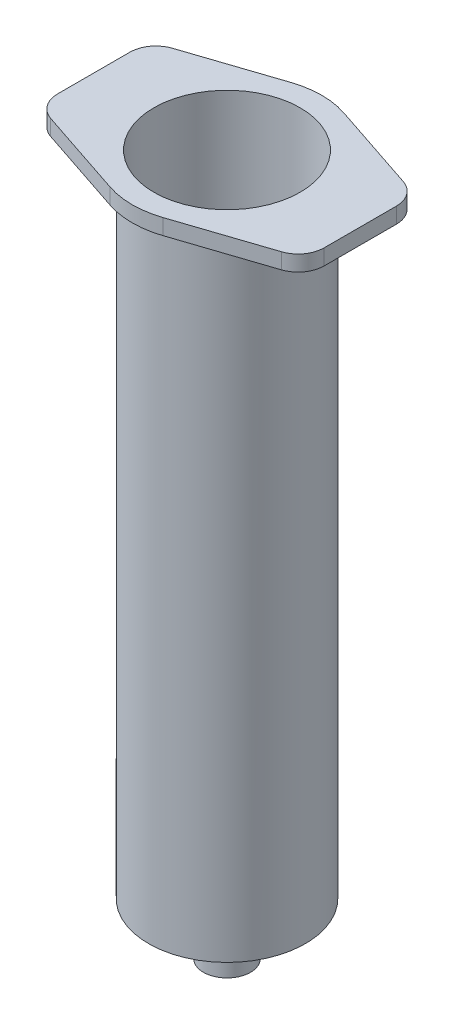
ISO-10303-21;
HEADER;
FILE_DESCRIPTION(('STEP AP214'),'2;1');
FILE_NAME('part.step','',(''),(''),'','','');
FILE_SCHEMA(('AUTOMOTIVE_DESIGN { 1 0 10303 214 1 1 1 1 }'));
ENDSEC;
DATA;
#1=APPLICATION_CONTEXT('core data for automotive mechanical design processes');
#2=APPLICATION_PROTOCOL_DEFINITION('international standard','automotive_design',2000,#1);
#3=PRODUCT_CONTEXT('',#1,'mechanical');
#4=PRODUCT('Part','Part','',(#3));
#5=PRODUCT_RELATED_PRODUCT_CATEGORY('part','',(#4));
#6=PRODUCT_DEFINITION_FORMATION('','',#4);
#7=PRODUCT_DEFINITION_CONTEXT('part definition',#1,'design');
#8=PRODUCT_DEFINITION('design','',#6,#7);
#9=PRODUCT_DEFINITION_SHAPE('','',#8);
#10=(LENGTH_UNIT() NAMED_UNIT(*) SI_UNIT(.MILLI.,.METRE.));
#11=(NAMED_UNIT(*) PLANE_ANGLE_UNIT() SI_UNIT($,.RADIAN.));
#12=(NAMED_UNIT(*) SI_UNIT($,.STERADIAN.) SOLID_ANGLE_UNIT());
#13=UNCERTAINTY_MEASURE_WITH_UNIT(LENGTH_MEASURE(1.E-05),#10,'distance_accuracy_value','');
#14=(GEOMETRIC_REPRESENTATION_CONTEXT(3) GLOBAL_UNCERTAINTY_ASSIGNED_CONTEXT((#13)) GLOBAL_UNIT_ASSIGNED_CONTEXT((#10,
#11,#12)) REPRESENTATION_CONTEXT('',''));
#15=CARTESIAN_POINT('',(0.,0.,0.));
#16=DIRECTION('',(0.,0.,1.));
#17=DIRECTION('',(1.,0.,0.));
#18=AXIS2_PLACEMENT_3D('',#15,#16,#17);
#19=CARTESIAN_POINT('',(0.,0.,0.));
#20=DIRECTION('',(0.,1.,0.));
#21=DIRECTION('',(-1.,0.,0.));
#22=AXIS2_PLACEMENT_3D('',#19,#20,#21);
#23=CYLINDRICAL_SURFACE('',#22,15.);
#24=CARTESIAN_POINT('',(0.,-124.,0.));
#25=DIRECTION('',(0.,1.,0.));
#26=DIRECTION('',(-1.,0.,0.));
#27=AXIS2_PLACEMENT_3D('',#24,#25,#26);
#28=CIRCLE('',#27,15.);
#29=CARTESIAN_POINT('',(-14.9999999999999,-124.,0.));
#30=VERTEX_POINT('',#29);
#31=EDGE_CURVE('E291',#30,#30,#28,.T.);
#32=ORIENTED_EDGE('',*,*,#31,.T.);
#33=EDGE_LOOP('',(#32));
#34=FACE_BOUND('',#33,.T.);
#35=CARTESIAN_POINT('',(0.,-3.,0.));
#36=DIRECTION('',(0.,1.,0.));
#37=DIRECTION('',(0.,0.,1.));
#38=AXIS2_PLACEMENT_3D('',#35,#36,#37);
#39=CIRCLE('',#38,15.);
#40=CARTESIAN_POINT('',(0.,-3.,15.));
#41=VERTEX_POINT('',#40);
#42=EDGE_CURVE('E167',#41,#41,#39,.T.);
#43=ORIENTED_EDGE('',*,*,#42,.F.);
#44=EDGE_LOOP('',(#43));
#45=FACE_BOUND('',#44,.T.);
#46=ADVANCED_FACE('F46',(#34,#45),#23,.T.);
#47=CARTESIAN_POINT('',(0.,-134.,0.));
#48=DIRECTION('',(0.,1.,0.));
#49=DIRECTION('',(-1.,0.,0.));
#50=AXIS2_PLACEMENT_3D('',#47,#48,#49);
#51=PLANE('',#50);
#52=CARTESIAN_POINT('',(0.,-134.,0.));
#53=DIRECTION('',(0.,1.,0.));
#54=DIRECTION('',(-1.,0.,0.));
#55=AXIS2_PLACEMENT_3D('',#52,#53,#54);
#56=CIRCLE('',#55,3.74999999999999);
#57=CARTESIAN_POINT('',(-3.74999999999999,-134.,0.));
#58=VERTEX_POINT('',#57);
#59=EDGE_CURVE('E282',#58,#58,#56,.T.);
#60=ORIENTED_EDGE('',*,*,#59,.T.);
#61=EDGE_LOOP('',(#60));
#62=FACE_BOUND('',#61,.T.);
#63=CARTESIAN_POINT('',(0.,-134.,0.));
#64=DIRECTION('',(0.,1.,0.));
#65=DIRECTION('',(-1.,0.,0.));
#66=AXIS2_PLACEMENT_3D('',#63,#64,#65);
#67=CIRCLE('',#66,4.49999999999999);
#68=CARTESIAN_POINT('',(-4.49999999999999,-134.,0.));
#69=VERTEX_POINT('',#68);
#70=EDGE_CURVE('E174',#69,#69,#67,.T.);
#71=ORIENTED_EDGE('',*,*,#70,.F.);
#72=EDGE_LOOP('',(#71));
#73=FACE_BOUND('',#72,.T.);
#74=ADVANCED_FACE('F309',(#62,#73),#51,.F.);
#75=CARTESIAN_POINT('',(0.,0.,0.));
#76=DIRECTION('',(0.,1.,0.));
#77=DIRECTION('',(-1.,0.,0.));
#78=AXIS2_PLACEMENT_3D('',#75,#76,#77);
#79=CYLINDRICAL_SURFACE('',#78,4.49999999999999);
#80=CARTESIAN_POINT('',(0.,-126.,0.));
#81=DIRECTION('',(0.,1.,0.));
#82=DIRECTION('',(-1.,0.,0.));
#83=AXIS2_PLACEMENT_3D('',#80,#81,#82);
#84=CIRCLE('',#83,4.49999999999999);
#85=CARTESIAN_POINT('',(-4.49999999999992,-126.,0.));
#86=VERTEX_POINT('',#85);
#87=EDGE_CURVE('E299',#86,#86,#84,.T.);
#88=ORIENTED_EDGE('',*,*,#87,.F.);
#89=EDGE_LOOP('',(#88));
#90=FACE_BOUND('',#89,.T.);
#91=ORIENTED_EDGE('',*,*,#70,.T.);
#92=EDGE_LOOP('',(#91));
#93=FACE_BOUND('',#92,.T.);
#94=ADVANCED_FACE('F307',(#90,#93),#79,.T.);
#95=CARTESIAN_POINT('',(0.,-126.,0.));
#96=DIRECTION('',(0.,1.,0.));
#97=DIRECTION('',(-1.,0.,0.));
#98=AXIS2_PLACEMENT_3D('',#95,#96,#97);
#99=CONICAL_SURFACE('',#98,4.49999999999999,1.38257482149013);
#100=CARTESIAN_POINT('',(-14.9999999999999,-124.,0.));
#101=CARTESIAN_POINT('',(-14.8906249999999,-124.020833333333,0.));
#102=CARTESIAN_POINT('',(-14.7812499999999,-124.041666666667,0.));
#103=CARTESIAN_POINT('',(-14.5624999999999,-124.083333333333,0.));
#104=CARTESIAN_POINT('',(-14.4531249999999,-124.104166666667,0.));
#105=CARTESIAN_POINT('',(-14.2343749999999,-124.145833333333,0.));
#106=CARTESIAN_POINT('',(-14.1249999999999,-124.166666666667,0.));
#107=CARTESIAN_POINT('',(-13.9062499999999,-124.208333333333,0.));
#108=CARTESIAN_POINT('',(-13.7968749999999,-124.229166666667,0.));
#109=CARTESIAN_POINT('',(-13.5781249999999,-124.270833333333,0.));
#110=CARTESIAN_POINT('',(-13.4687499999999,-124.291666666667,0.));
#111=CARTESIAN_POINT('',(-13.2499999999999,-124.333333333333,0.));
#112=CARTESIAN_POINT('',(-13.1406249999999,-124.354166666667,0.));
#113=CARTESIAN_POINT('',(-12.9218749999999,-124.395833333333,0.));
#114=CARTESIAN_POINT('',(-12.8124999999999,-124.416666666667,0.));
#115=CARTESIAN_POINT('',(-12.5937499999999,-124.458333333333,0.));
#116=CARTESIAN_POINT('',(-12.4843749999999,-124.479166666667,0.));
#117=CARTESIAN_POINT('',(-12.2656249999999,-124.520833333333,0.));
#118=CARTESIAN_POINT('',(-12.1562499999999,-124.541666666667,0.));
#119=CARTESIAN_POINT('',(-11.9374999999999,-124.583333333333,0.));
#120=CARTESIAN_POINT('',(-11.8281249999999,-124.604166666667,0.));
#121=CARTESIAN_POINT('',(-11.6093749999999,-124.645833333333,0.));
#122=CARTESIAN_POINT('',(-11.4999999999999,-124.666666666667,0.));
#123=CARTESIAN_POINT('',(-11.2812499999999,-124.708333333333,0.));
#124=CARTESIAN_POINT('',(-11.1718749999999,-124.729166666667,0.));
#125=CARTESIAN_POINT('',(-10.9531249999999,-124.770833333333,0.));
#126=CARTESIAN_POINT('',(-10.8437499999999,-124.791666666667,0.));
#127=CARTESIAN_POINT('',(-10.6249999999999,-124.833333333333,0.));
#128=CARTESIAN_POINT('',(-10.5156249999999,-124.854166666667,0.));
#129=CARTESIAN_POINT('',(-10.2968749999999,-124.895833333333,0.));
#130=CARTESIAN_POINT('',(-10.1874999999999,-124.916666666667,0.));
#131=CARTESIAN_POINT('',(-9.9687499999999,-124.958333333333,0.));
#132=CARTESIAN_POINT('',(-9.8593749999999,-124.979166666667,0.));
#133=CARTESIAN_POINT('',(-9.6406249999999,-125.020833333333,0.));
#134=CARTESIAN_POINT('',(-9.5312499999999,-125.041666666667,0.));
#135=CARTESIAN_POINT('',(-9.3124999999999,-125.083333333333,0.));
#136=CARTESIAN_POINT('',(-9.2031249999999,-125.104166666667,0.));
#137=CARTESIAN_POINT('',(-8.9843749999999,-125.145833333333,0.));
#138=CARTESIAN_POINT('',(-8.8749999999999,-125.166666666667,0.));
#139=CARTESIAN_POINT('',(-8.65624999999991,-125.208333333333,0.));
#140=CARTESIAN_POINT('',(-8.5468749999999,-125.229166666667,0.));
#141=CARTESIAN_POINT('',(-8.3281249999999,-125.270833333333,0.));
#142=CARTESIAN_POINT('',(-8.2187499999999,-125.291666666667,0.));
#143=CARTESIAN_POINT('',(-7.9999999999999,-125.333333333333,0.));
#144=CARTESIAN_POINT('',(-7.89062499999991,-125.354166666667,0.));
#145=CARTESIAN_POINT('',(-7.67187499999991,-125.395833333333,0.));
#146=CARTESIAN_POINT('',(-7.5624999999999,-125.416666666667,0.));
#147=CARTESIAN_POINT('',(-7.34374999999991,-125.458333333333,0.));
#148=CARTESIAN_POINT('',(-7.23437499999991,-125.479166666667,0.));
#149=CARTESIAN_POINT('',(-7.01562499999991,-125.520833333333,0.));
#150=CARTESIAN_POINT('',(-6.90624999999991,-125.541666666667,0.));
#151=CARTESIAN_POINT('',(-6.68749999999991,-125.583333333333,0.));
#152=CARTESIAN_POINT('',(-6.57812499999991,-125.604166666667,0.));
#153=CARTESIAN_POINT('',(-6.35937499999991,-125.645833333333,0.));
#154=CARTESIAN_POINT('',(-6.24999999999991,-125.666666666667,0.));
#155=CARTESIAN_POINT('',(-6.03124999999991,-125.708333333333,0.));
#156=CARTESIAN_POINT('',(-5.92187499999991,-125.729166666667,0.));
#157=CARTESIAN_POINT('',(-5.70312499999991,-125.770833333333,0.));
#158=CARTESIAN_POINT('',(-5.59374999999991,-125.791666666667,0.));
#159=CARTESIAN_POINT('',(-5.37499999999991,-125.833333333333,0.));
#160=CARTESIAN_POINT('',(-5.26562499999991,-125.854166666667,0.));
#161=CARTESIAN_POINT('',(-5.04687499999991,-125.895833333333,0.));
#162=CARTESIAN_POINT('',(-4.93749999999991,-125.916666666667,0.));
#163=CARTESIAN_POINT('',(-4.71874999999991,-125.958333333333,0.));
#164=CARTESIAN_POINT('',(-4.60937499999991,-125.979166666667,0.));
#165=CARTESIAN_POINT('',(-4.49999999999992,-126.,0.));
#166=B_SPLINE_CURVE_WITH_KNOTS('',3,(#100,#101,#102,#103,#104,#105,#106,#107,#108,#109,#110,
#111,#112,#113,#114,#115,#116,#117,#118,#119,#120,#121,#122,#123,#124,#125,#126,#127,#128,#129,
#130,#131,#132,#133,#134,#135,#136,#137,#138,#139,#140,#141,#142,#143,#144,#145,#146,#147,#148,
#149,#150,#151,#152,#153,#154,#155,#156,#157,#158,#159,#160,#161,#162,#163,#164,#165),
.UNSPECIFIED.,.F.,.F.,(4,2,2,2,2,2,2,2,2,2,2,2,2,2,2,2,2,2,2,2,2,2,2,2,2,2,2,2,2,2,2,2,4),(0.,
0.334024348850499,0.668048697700999,1.0020730465515,1.33609739540199,1.67012174425249,
2.00414609310299,2.33817044195349,2.67219479080399,3.00621913965449,3.34024348850499,
3.67426783735548,4.00829218620598,4.34231653505648,4.67634088390698,5.01036523275748,
5.34438958160797,5.67841393045847,6.01243827930897,6.34646262815947,6.68048697700997,
7.01451132586047,7.34853567471096,7.68256002356146,8.01658437241196,8.35060872126246,
8.68463307011295,9.01865741896345,9.35268176781396,9.68670611666445,10.0207304655149,
10.3547548143654,10.6887791632159),.UNSPECIFIED.);
#167=EDGE_CURVE('BSEAM317',#30,#86,#166,.T.);
#168=ORIENTED_EDGE('',*,*,#31,.F.);
#169=ORIENTED_EDGE('',*,*,#87,.T.);
#170=ORIENTED_EDGE('',*,*,#167,.T.);
#171=ORIENTED_EDGE('',*,*,#167,.F.);
#172=EDGE_LOOP('',(#168,#170,#169,#171));
#173=FACE_BOUND('',#172,.T.);
#174=ADVANCED_FACE('F317',(#173),#99,.T.);
#175=CARTESIAN_POINT('',(15.0000000000001,0.,0.));
#176=DIRECTION('',(0.,-1.,0.));
#177=DIRECTION('',(1.,0.,0.));
#178=AXIS2_PLACEMENT_3D('',#175,#176,#177);
#179=PLANE('',#178);
#180=CARTESIAN_POINT('',(0.,0.,0.));
#181=DIRECTION('',(0.,-1.,0.));
#182=DIRECTION('',(1.,0.,0.));
#183=AXIS2_PLACEMENT_3D('',#180,#181,#182);
#184=CIRCLE('',#183,14.);
#185=CARTESIAN_POINT('',(14.,0.,0.));
#186=VERTEX_POINT('',#185);
#187=EDGE_CURVE('E287',#186,#186,#184,.F.);
#188=ORIENTED_EDGE('',*,*,#187,.F.);
#189=EDGE_LOOP('',(#188));
#190=FACE_BOUND('',#189,.T.);
#191=DIRECTION('',(-0.948683298050515,0.,0.316227766016838));
#192=VECTOR('',#191,1.);
#193=CARTESIAN_POINT('',(0.,0.,-19.));
#194=LINE('',#193,#192);
#195=CARTESIAN_POINT('',(-5.05964425626941,0.,-17.3134519145769));
#196=VERTEX_POINT('',#195);
#197=CARTESIAN_POINT('',(-22.0811388300842,0.,-11.6396203899719));
#198=VERTEX_POINT('',#197);
#199=EDGE_CURVE('E149',#196,#198,#194,.T.);
#200=ORIENTED_EDGE('',*,*,#199,.T.);
#201=CARTESIAN_POINT('',(-20.5,0.,-6.89620389971938));
#202=DIRECTION('',(0.,-1.,0.));
#203=DIRECTION('',(1.,0.,0.));
#204=AXIS2_PLACEMENT_3D('',#201,#202,#203);
#205=CIRCLE('',#204,5.);
#206=CARTESIAN_POINT('',(-25.5,0.,-6.89620389971941));
#207=VERTEX_POINT('',#206);
#208=EDGE_CURVE('E206',#198,#207,#205,.F.);
#209=ORIENTED_EDGE('',*,*,#208,.T.);
#210=DIRECTION('',(0.,0.,1.));
#211=VECTOR('',#210,1.);
#212=CARTESIAN_POINT('',(-25.5,0.,-10.5));
#213=LINE('',#212,#211);
#214=CARTESIAN_POINT('',(-25.5,0.,6.89620389971938));
#215=VERTEX_POINT('',#214);
#216=EDGE_CURVE('E273',#207,#215,#213,.T.);
#217=ORIENTED_EDGE('',*,*,#216,.T.);
#218=CARTESIAN_POINT('',(-20.5,0.,6.89620389971935));
#219=DIRECTION('',(0.,-1.,0.));
#220=DIRECTION('',(1.,0.,0.));
#221=AXIS2_PLACEMENT_3D('',#218,#219,#220);
#222=CIRCLE('',#221,5.);
#223=CARTESIAN_POINT('',(-22.0811388300842,0.,11.6396203899719));
#224=VERTEX_POINT('',#223);
#225=EDGE_CURVE('E203',#215,#224,#222,.F.);
#226=ORIENTED_EDGE('',*,*,#225,.T.);
#227=DIRECTION('',(0.948683298050515,0.,0.316227766016838));
#228=VECTOR('',#227,1.);
#229=CARTESIAN_POINT('',(-25.5,0.,10.5));
#230=LINE('',#229,#228);
#231=CARTESIAN_POINT('',(-5.05964425626941,0.,17.3134519145769));
#232=VERTEX_POINT('',#231);
#233=EDGE_CURVE('E262',#224,#232,#230,.T.);
#234=ORIENTED_EDGE('',*,*,#233,.T.);
#235=CARTESIAN_POINT('',(0.,0.,2.13451914576863));
#236=DIRECTION('',(0.,-1.,0.));
#237=DIRECTION('',(1.,0.,0.));
#238=AXIS2_PLACEMENT_3D('',#235,#236,#237);
#239=CIRCLE('',#238,16.);
#240=CARTESIAN_POINT('',(5.05964425626941,0.,17.3134519145769));
#241=VERTEX_POINT('',#240);
#242=EDGE_CURVE('E160',#232,#241,#239,.F.);
#243=ORIENTED_EDGE('',*,*,#242,.T.);
#244=DIRECTION('',(0.948683298050515,0.,-0.316227766016838));
#245=VECTOR('',#244,1.);
#246=CARTESIAN_POINT('',(0.,0.,19.));
#247=LINE('',#246,#245);
#248=CARTESIAN_POINT('',(22.0811388300842,0.,11.6396203899719));
#249=VERTEX_POINT('',#248);
#250=EDGE_CURVE('E258',#241,#249,#247,.T.);
#251=ORIENTED_EDGE('',*,*,#250,.T.);
#252=CARTESIAN_POINT('',(20.5,0.,6.89620389971936));
#253=DIRECTION('',(0.,-1.,0.));
#254=DIRECTION('',(1.,0.,0.));
#255=AXIS2_PLACEMENT_3D('',#252,#253,#254);
#256=CIRCLE('',#255,5.);
#257=CARTESIAN_POINT('',(25.5000000000001,0.,6.89620389971937));
#258=VERTEX_POINT('',#257);
#259=EDGE_CURVE('E200',#249,#258,#256,.F.);
#260=ORIENTED_EDGE('',*,*,#259,.T.);
#261=DIRECTION('',(0.,0.,-1.));
#262=VECTOR('',#261,1.);
#263=CARTESIAN_POINT('',(25.5000000000001,0.,10.5));
#264=LINE('',#263,#262);
#265=CARTESIAN_POINT('',(25.5000000000001,0.,-6.89620389971938));
#266=VERTEX_POINT('',#265);
#267=EDGE_CURVE('E150',#258,#266,#264,.T.);
#268=ORIENTED_EDGE('',*,*,#267,.T.);
#269=CARTESIAN_POINT('',(20.5000000000001,0.,-6.89620389971938));
#270=DIRECTION('',(0.,-1.,0.));
#271=DIRECTION('',(1.,0.,0.));
#272=AXIS2_PLACEMENT_3D('',#269,#270,#271);
#273=CIRCLE('',#272,5.);
#274=CARTESIAN_POINT('',(22.0811388300843,0.,-11.639620389972));
#275=VERTEX_POINT('',#274);
#276=EDGE_CURVE('E144',#266,#275,#273,.F.);
#277=ORIENTED_EDGE('',*,*,#276,.T.);
#278=DIRECTION('',(-0.948683298050514,0.,-0.316227766016839));
#279=VECTOR('',#278,1.);
#280=CARTESIAN_POINT('',(25.5000000000001,0.,-10.5));
#281=LINE('',#280,#279);
#282=CARTESIAN_POINT('',(5.05964425626943,0.,-17.3134519145769));
#283=VERTEX_POINT('',#282);
#284=EDGE_CURVE('E137',#275,#283,#281,.T.);
#285=ORIENTED_EDGE('',*,*,#284,.T.);
#286=CARTESIAN_POINT('',(0.,0.,-2.13451914576864));
#287=DIRECTION('',(0.,-1.,0.));
#288=DIRECTION('',(1.,0.,0.));
#289=AXIS2_PLACEMENT_3D('',#286,#287,#288);
#290=CIRCLE('',#289,16.);
#291=EDGE_CURVE('E141',#283,#196,#290,.F.);
#292=ORIENTED_EDGE('',*,*,#291,.T.);
#293=EDGE_LOOP('',(#200,#209,#217,#226,#234,#243,#251,#260,#268,#277,#285,#292));
#294=FACE_BOUND('',#293,.T.);
#295=ADVANCED_FACE('F140',(#190,#294),#179,.F.);
#296=CARTESIAN_POINT('',(0.,0.,0.));
#297=DIRECTION('',(0.,1.,0.));
#298=DIRECTION('',(-1.,0.,0.));
#299=AXIS2_PLACEMENT_3D('',#296,#297,#298);
#300=CYLINDRICAL_SURFACE('',#299,3.74999999999999);
#301=CARTESIAN_POINT('',(0.,-125.124878174932,0.));
#302=DIRECTION('',(0.,1.,0.));
#303=DIRECTION('',(-1.,0.,0.));
#304=AXIS2_PLACEMENT_3D('',#301,#302,#303);
#305=CIRCLE('',#304,3.74999999999999);
#306=CARTESIAN_POINT('',(-3.74999999999996,-125.124878174932,0.));
#307=VERTEX_POINT('',#306);
#308=EDGE_CURVE('E278',#307,#307,#305,.T.);
#309=ORIENTED_EDGE('',*,*,#308,.T.);
#310=EDGE_LOOP('',(#309));
#311=FACE_BOUND('',#310,.T.);
#312=ORIENTED_EDGE('',*,*,#59,.F.);
#313=EDGE_LOOP('',(#312));
#314=FACE_BOUND('',#313,.T.);
#315=ADVANCED_FACE('F391',(#311,#314),#300,.F.);
#316=CARTESIAN_POINT('',(0.,-125.017661433578,0.));
#317=DIRECTION('',(0.,1.,0.));
#318=DIRECTION('',(-1.,0.,0.));
#319=AXIS2_PLACEMENT_3D('',#316,#317,#318);
#320=CONICAL_SURFACE('',#319,4.31288789211,1.38257482149013);
#321=CARTESIAN_POINT('',(0.,-123.172497222551,0.));
#322=DIRECTION('',(0.,1.,0.));
#323=DIRECTION('',(-1.,0.,0.));
#324=AXIS2_PLACEMENT_3D('',#321,#322,#323);
#325=CIRCLE('',#324,14.);
#326=CARTESIAN_POINT('',(-14.0000000000001,-123.172497222551,0.));
#327=VERTEX_POINT('',#326);
#328=EDGE_CURVE('E283',#327,#327,#325,.T.);
#329=CARTESIAN_POINT('',(-14.0000000000001,-123.172497222551,0.));
#330=CARTESIAN_POINT('',(-13.8932291666667,-123.192834524138,0.));
#331=CARTESIAN_POINT('',(-13.7864583333334,-123.213171825725,0.));
#332=CARTESIAN_POINT('',(-13.5729166666667,-123.2538464289,0.));
#333=CARTESIAN_POINT('',(-13.4661458333334,-123.274183730487,0.));
#334=CARTESIAN_POINT('',(-13.2526041666667,-123.314858333662,0.));
#335=CARTESIAN_POINT('',(-13.1458333333334,-123.335195635249,0.));
#336=CARTESIAN_POINT('',(-12.9322916666667,-123.375870238424,0.));
#337=CARTESIAN_POINT('',(-12.8255208333334,-123.396207540011,0.));
#338=CARTESIAN_POINT('',(-12.6119791666667,-123.436882143186,0.));
#339=CARTESIAN_POINT('',(-12.5052083333334,-123.457219444773,0.));
#340=CARTESIAN_POINT('',(-12.2916666666667,-123.497894047948,0.));
#341=CARTESIAN_POINT('',(-12.1848958333334,-123.518231349535,0.));
#342=CARTESIAN_POINT('',(-11.9713541666667,-123.55890595271,0.));
#343=CARTESIAN_POINT('',(-11.8645833333334,-123.579243254297,0.));
#344=CARTESIAN_POINT('',(-11.6510416666667,-123.619917857472,0.));
#345=CARTESIAN_POINT('',(-11.5442708333334,-123.640255159059,0.));
#346=CARTESIAN_POINT('',(-11.3307291666667,-123.680929762233,0.));
#347=CARTESIAN_POINT('',(-11.2239583333334,-123.701267063821,0.));
#348=CARTESIAN_POINT('',(-11.0104166666667,-123.741941666995,0.));
#349=CARTESIAN_POINT('',(-10.9036458333334,-123.762278968583,0.));
#350=CARTESIAN_POINT('',(-10.6901041666667,-123.802953571757,0.));
#351=CARTESIAN_POINT('',(-10.5833333333334,-123.823290873345,0.));
#352=CARTESIAN_POINT('',(-10.3697916666667,-123.863965476519,0.));
#353=CARTESIAN_POINT('',(-10.2630208333334,-123.884302778106,0.));
#354=CARTESIAN_POINT('',(-10.0494791666667,-123.924977381281,0.));
#355=CARTESIAN_POINT('',(-9.94270833333337,-123.945314682868,0.));
#356=CARTESIAN_POINT('',(-9.7291666666667,-123.985989286043,0.));
#357=CARTESIAN_POINT('',(-9.62239583333337,-124.00632658763,0.));
#358=CARTESIAN_POINT('',(-9.4088541666667,-124.047001190805,0.));
#359=CARTESIAN_POINT('',(-9.30208333333336,-124.067338492392,0.));
#360=CARTESIAN_POINT('',(-9.08854166666669,-124.108013095567,0.));
#361=CARTESIAN_POINT('',(-8.98177083333336,-124.128350397154,0.));
#362=CARTESIAN_POINT('',(-8.76822916666669,-124.169025000329,0.));
#363=CARTESIAN_POINT('',(-8.66145833333335,-124.189362301916,0.));
#364=CARTESIAN_POINT('',(-8.44791666666669,-124.230036905091,0.));
#365=CARTESIAN_POINT('',(-8.34114583333335,-124.250374206678,0.));
#366=CARTESIAN_POINT('',(-8.12760416666668,-124.291048809852,0.));
#367=CARTESIAN_POINT('',(-8.02083333333335,-124.31138611144,0.));
#368=CARTESIAN_POINT('',(-7.80729166666668,-124.352060714614,0.));
#369=CARTESIAN_POINT('',(-7.70052083333334,-124.372398016202,0.));
#370=CARTESIAN_POINT('',(-7.48697916666667,-124.413072619376,0.));
#371=CARTESIAN_POINT('',(-7.38020833333334,-124.433409920964,0.));
#372=CARTESIAN_POINT('',(-7.16666666666667,-124.474084524138,0.));
#373=CARTESIAN_POINT('',(-7.05989583333334,-124.494421825725,0.));
#374=CARTESIAN_POINT('',(-6.84635416666667,-124.5350964289,0.));
#375=CARTESIAN_POINT('',(-6.73958333333333,-124.555433730487,0.));
#376=CARTESIAN_POINT('',(-6.52604166666666,-124.596108333662,0.));
#377=CARTESIAN_POINT('',(-6.41927083333333,-124.616445635249,0.));
#378=CARTESIAN_POINT('',(-6.20572916666666,-124.657120238424,0.));
#379=CARTESIAN_POINT('',(-6.09895833333332,-124.677457540011,0.));
#380=CARTESIAN_POINT('',(-5.88541666666666,-124.718132143186,0.));
#381=CARTESIAN_POINT('',(-5.77864583333332,-124.738469444773,0.));
#382=CARTESIAN_POINT('',(-5.56510416666665,-124.779144047948,0.));
#383=CARTESIAN_POINT('',(-5.45833333333332,-124.799481349535,0.));
#384=CARTESIAN_POINT('',(-5.24479166666665,-124.84015595271,0.));
#385=CARTESIAN_POINT('',(-5.13802083333331,-124.860493254297,0.));
#386=CARTESIAN_POINT('',(-4.92447916666664,-124.901167857472,0.));
#387=CARTESIAN_POINT('',(-4.81770833333331,-124.921505159059,0.));
#388=CARTESIAN_POINT('',(-4.60416666666664,-124.962179762233,0.));
#389=CARTESIAN_POINT('',(-4.49739583333331,-124.982517063821,0.));
#390=CARTESIAN_POINT('',(-4.28385416666664,-125.023191666995,0.));
#391=CARTESIAN_POINT('',(-4.1770833333333,-125.043528968583,0.));
#392=CARTESIAN_POINT('',(-3.96354166666663,-125.084203571757,0.));
#393=CARTESIAN_POINT('',(-3.8567708333333,-125.104540873345,0.));
#394=CARTESIAN_POINT('',(-3.74999999999996,-125.124878174932,0.));
#395=B_SPLINE_CURVE_WITH_KNOTS('',3,(#329,#330,#331,#332,#333,#334,#335,#336,#337,#338,#339,
#340,#341,#342,#343,#344,#345,#346,#347,#348,#349,#350,#351,#352,#353,#354,#355,#356,#357,#358,
#359,#360,#361,#362,#363,#364,#365,#366,#367,#368,#369,#370,#371,#372,#373,#374,#375,#376,#377,
#378,#379,#380,#381,#382,#383,#384,#385,#386,#387,#388,#389,#390,#391,#392,#393,#394),
.UNSPECIFIED.,.F.,.F.,(4,2,2,2,2,2,2,2,2,2,2,2,2,2,2,2,2,2,2,2,2,2,2,2,2,2,2,2,2,2,2,2,4),(0.,
0.326071388163588,0.652142776327175,0.97821416449076,1.30428555265435,1.63035694081793,
1.95642832898152,2.2824997171451,2.60857110530869,2.93464249347228,3.26071388163587,
3.58678526979945,3.91285665796304,4.23892804612662,4.56499943429021,4.8910708224538,
5.21714221061738,5.54321359878097,5.86928498694456,6.19535637510814,6.52142776327173,
6.84749915143531,7.1735705395989,7.49964192776249,7.82571331592607,8.15178470408966,
8.47785609225325,8.80392748041683,9.12999886858042,9.456070256744,9.78214164490758,
10.1082130330712,10.4342844212348),.UNSPECIFIED.);
#396=EDGE_CURVE('BSEAM385',#327,#307,#395,.T.);
#397=ORIENTED_EDGE('',*,*,#328,.T.);
#398=ORIENTED_EDGE('',*,*,#308,.F.);
#399=ORIENTED_EDGE('',*,*,#396,.T.);
#400=ORIENTED_EDGE('',*,*,#396,.F.);
#401=EDGE_LOOP('',(#397,#399,#398,#400));
#402=FACE_BOUND('',#401,.T.);
#403=ADVANCED_FACE('F385',(#402),#320,.F.);
#404=CARTESIAN_POINT('',(0.,0.,0.));
#405=DIRECTION('',(0.,1.,0.));
#406=DIRECTION('',(-1.,0.,0.));
#407=AXIS2_PLACEMENT_3D('',#404,#405,#406);
#408=CYLINDRICAL_SURFACE('',#407,14.);
#409=ORIENTED_EDGE('',*,*,#187,.T.);
#410=EDGE_LOOP('',(#409));
#411=FACE_BOUND('',#410,.T.);
#412=ORIENTED_EDGE('',*,*,#328,.F.);
#413=EDGE_LOOP('',(#412));
#414=FACE_BOUND('',#413,.T.);
#415=ADVANCED_FACE('F377',(#411,#414),#408,.F.);
#416=CARTESIAN_POINT('',(-25.5,-3.,10.5));
#417=DIRECTION('',(-0.316227766016838,0.,0.948683298050514));
#418=DIRECTION('',(0.948683298050515,0.,0.316227766016838));
#419=AXIS2_PLACEMENT_3D('',#416,#417,#418);
#420=PLANE('',#419);
#421=ORIENTED_EDGE('',*,*,#233,.F.);
#422=DIRECTION('',(0.,1.,0.));
#423=VECTOR('',#422,1.);
#424=CARTESIAN_POINT('',(-22.0811388300842,-3.,11.6396203899719));
#425=LINE('',#424,#423);
#426=CARTESIAN_POINT('',(-22.0811388300842,-3.,11.6396203899719));
#427=VERTEX_POINT('',#426);
#428=EDGE_CURVE('E62',#224,#427,#425,.F.);
#429=ORIENTED_EDGE('',*,*,#428,.T.);
#430=DIRECTION('',(0.948683298050515,0.,0.316227766016838));
#431=VECTOR('',#430,1.);
#432=CARTESIAN_POINT('',(-25.5,-3.,10.5));
#433=LINE('',#432,#431);
#434=CARTESIAN_POINT('',(-5.05964425626941,-3.,17.3134519145769));
#435=VERTEX_POINT('',#434);
#436=EDGE_CURVE('E277',#427,#435,#433,.T.);
#437=ORIENTED_EDGE('',*,*,#436,.T.);
#438=DIRECTION('',(0.,1.,0.));
#439=VECTOR('',#438,1.);
#440=CARTESIAN_POINT('',(-5.05964425626942,-3.,17.3134519145769));
#441=LINE('',#440,#439);
#442=EDGE_CURVE('E187',#435,#232,#441,.T.);
#443=ORIENTED_EDGE('',*,*,#442,.T.);
#444=EDGE_LOOP('',(#421,#429,#437,#443));
#445=FACE_BOUND('',#444,.T.);
#446=ADVANCED_FACE('F363',(#445),#420,.T.);
#447=CARTESIAN_POINT('',(-25.5,-3.,-10.5));
#448=DIRECTION('',(-1.,0.,0.));
#449=DIRECTION('',(0.,0.,1.));
#450=AXIS2_PLACEMENT_3D('',#447,#448,#449);
#451=PLANE('',#450);
#452=ORIENTED_EDGE('',*,*,#216,.F.);
#453=DIRECTION('',(0.,1.,0.));
#454=VECTOR('',#453,1.);
#455=CARTESIAN_POINT('',(-25.5,-3.,-6.89620389971941));
#456=LINE('',#455,#454);
#457=CARTESIAN_POINT('',(-25.5,-3.,-6.89620389971941));
#458=VERTEX_POINT('',#457);
#459=EDGE_CURVE('E213',#207,#458,#456,.F.);
#460=ORIENTED_EDGE('',*,*,#459,.T.);
#461=DIRECTION('',(0.,0.,1.));
#462=VECTOR('',#461,1.);
#463=CARTESIAN_POINT('',(-25.5,-3.,-10.5));
#464=LINE('',#463,#462);
#465=CARTESIAN_POINT('',(-25.5,-3.,6.89620389971938));
#466=VERTEX_POINT('',#465);
#467=EDGE_CURVE('E295',#458,#466,#464,.T.);
#468=ORIENTED_EDGE('',*,*,#467,.T.);
#469=DIRECTION('',(0.,1.,0.));
#470=VECTOR('',#469,1.);
#471=CARTESIAN_POINT('',(-25.5,-3.,6.89620389971938));
#472=LINE('',#471,#470);
#473=EDGE_CURVE('E209',#466,#215,#472,.T.);
#474=ORIENTED_EDGE('',*,*,#473,.T.);
#475=EDGE_LOOP('',(#452,#460,#468,#474));
#476=FACE_BOUND('',#475,.T.);
#477=ADVANCED_FACE('F359',(#476),#451,.T.);
#478=CARTESIAN_POINT('',(0.,-3.,-19.));
#479=DIRECTION('',(-0.316227766016838,0.,-0.948683298050514));
#480=DIRECTION('',(-0.948683298050515,0.,0.316227766016838));
#481=AXIS2_PLACEMENT_3D('',#478,#479,#480);
#482=PLANE('',#481);
#483=DIRECTION('',(-0.948683298050515,0.,0.316227766016838));
#484=VECTOR('',#483,1.);
#485=CARTESIAN_POINT('',(0.,-3.,-19.));
#486=LINE('',#485,#484);
#487=CARTESIAN_POINT('',(-5.05964425626941,-3.,-17.3134519145769));
#488=VERTEX_POINT('',#487);
#489=CARTESIAN_POINT('',(-22.0811388300842,-3.,-11.6396203899719));
#490=VERTEX_POINT('',#489);
#491=EDGE_CURVE('E346',#488,#490,#486,.T.);
#492=ORIENTED_EDGE('',*,*,#491,.T.);
#493=DIRECTION('',(0.,1.,0.));
#494=VECTOR('',#493,1.);
#495=CARTESIAN_POINT('',(-22.0811388300842,-3.,-11.639620389972));
#496=LINE('',#495,#494);
#497=EDGE_CURVE('E194',#490,#198,#496,.T.);
#498=ORIENTED_EDGE('',*,*,#497,.T.);
#499=ORIENTED_EDGE('',*,*,#199,.F.);
#500=DIRECTION('',(0.,1.,0.));
#501=VECTOR('',#500,1.);
#502=CARTESIAN_POINT('',(-5.05964425626941,-3.,-17.3134519145769));
#503=LINE('',#502,#501);
#504=EDGE_CURVE('E158',#196,#488,#503,.F.);
#505=ORIENTED_EDGE('',*,*,#504,.T.);
#506=EDGE_LOOP('',(#492,#498,#499,#505));
#507=FACE_BOUND('',#506,.T.);
#508=ADVANCED_FACE('F383',(#507),#482,.T.);
#509=CARTESIAN_POINT('',(25.5000000000001,-3.,-10.5));
#510=DIRECTION('',(0.316227766016839,0.,-0.948683298050514));
#511=DIRECTION('',(-0.948683298050514,0.,-0.316227766016839));
#512=AXIS2_PLACEMENT_3D('',#509,#510,#511);
#513=PLANE('',#512);
#514=ORIENTED_EDGE('',*,*,#284,.F.);
#515=DIRECTION('',(0.,1.,0.));
#516=VECTOR('',#515,1.);
#517=CARTESIAN_POINT('',(22.0811388300843,-3.,-11.639620389972));
#518=LINE('',#517,#516);
#519=CARTESIAN_POINT('',(22.0811388300843,-3.,-11.639620389972));
#520=VERTEX_POINT('',#519);
#521=EDGE_CURVE('E11',#275,#520,#518,.F.);
#522=ORIENTED_EDGE('',*,*,#521,.T.);
#523=DIRECTION('',(-0.948683298050514,0.,-0.316227766016839));
#524=VECTOR('',#523,1.);
#525=CARTESIAN_POINT('',(25.5000000000001,-3.,-10.5));
#526=LINE('',#525,#524);
#527=CARTESIAN_POINT('',(5.05964425626943,-3.,-17.3134519145769));
#528=VERTEX_POINT('',#527);
#529=EDGE_CURVE('E164',#520,#528,#526,.T.);
#530=ORIENTED_EDGE('',*,*,#529,.T.);
#531=DIRECTION('',(0.,1.,0.));
#532=VECTOR('',#531,1.);
#533=CARTESIAN_POINT('',(5.05964425626943,-3.,-17.3134519145769));
#534=LINE('',#533,#532);
#535=EDGE_CURVE('E157',#528,#283,#534,.T.);
#536=ORIENTED_EDGE('',*,*,#535,.T.);
#537=EDGE_LOOP('',(#514,#522,#530,#536));
#538=FACE_BOUND('',#537,.T.);
#539=ADVANCED_FACE('F162',(#538),#513,.T.);
#540=CARTESIAN_POINT('',(25.5000000000001,-3.,10.5));
#541=DIRECTION('',(1.,0.,0.));
#542=DIRECTION('',(0.,0.,-1.));
#543=AXIS2_PLACEMENT_3D('',#540,#541,#542);
#544=PLANE('',#543);
#545=ORIENTED_EDGE('',*,*,#267,.F.);
#546=DIRECTION('',(0.,1.,0.));
#547=VECTOR('',#546,1.);
#548=CARTESIAN_POINT('',(25.5000000000001,-3.,6.89620389971937));
#549=LINE('',#548,#547);
#550=CARTESIAN_POINT('',(25.5000000000001,-3.,6.89620389971937));
#551=VERTEX_POINT('',#550);
#552=EDGE_CURVE('E55',#258,#551,#549,.F.);
#553=ORIENTED_EDGE('',*,*,#552,.T.);
#554=DIRECTION('',(0.,0.,-1.));
#555=VECTOR('',#554,1.);
#556=CARTESIAN_POINT('',(25.5000000000001,-3.,10.5));
#557=LINE('',#556,#555);
#558=CARTESIAN_POINT('',(25.5000000000001,-3.,-6.89620389971938));
#559=VERTEX_POINT('',#558);
#560=EDGE_CURVE('E243',#551,#559,#557,.T.);
#561=ORIENTED_EDGE('',*,*,#560,.T.);
#562=DIRECTION('',(0.,1.,0.));
#563=VECTOR('',#562,1.);
#564=CARTESIAN_POINT('',(25.5000000000001,-3.,-6.89620389971938));
#565=LINE('',#564,#563);
#566=EDGE_CURVE('E233',#559,#266,#565,.T.);
#567=ORIENTED_EDGE('',*,*,#566,.T.);
#568=EDGE_LOOP('',(#545,#553,#561,#567));
#569=FACE_BOUND('',#568,.T.);
#570=ADVANCED_FACE('F242',(#569),#544,.T.);
#571=CARTESIAN_POINT('',(0.,-3.,19.));
#572=DIRECTION('',(0.316227766016838,0.,0.948683298050515));
#573=DIRECTION('',(0.948683298050515,0.,-0.316227766016838));
#574=AXIS2_PLACEMENT_3D('',#571,#572,#573);
#575=PLANE('',#574);
#576=DIRECTION('',(0.948683298050515,0.,-0.316227766016838));
#577=VECTOR('',#576,1.);
#578=CARTESIAN_POINT('',(0.,-3.,19.));
#579=LINE('',#578,#577);
#580=CARTESIAN_POINT('',(5.05964425626941,-3.,17.3134519145769));
#581=VERTEX_POINT('',#580);
#582=CARTESIAN_POINT('',(22.0811388300842,-3.,11.6396203899719));
#583=VERTEX_POINT('',#582);
#584=EDGE_CURVE('E250',#581,#583,#579,.T.);
#585=ORIENTED_EDGE('',*,*,#584,.T.);
#586=DIRECTION('',(0.,1.,0.));
#587=VECTOR('',#586,1.);
#588=CARTESIAN_POINT('',(22.0811388300843,-3.,11.639620389972));
#589=LINE('',#588,#587);
#590=EDGE_CURVE('E229',#583,#249,#589,.T.);
#591=ORIENTED_EDGE('',*,*,#590,.T.);
#592=ORIENTED_EDGE('',*,*,#250,.F.);
#593=DIRECTION('',(0.,1.,0.));
#594=VECTOR('',#593,1.);
#595=CARTESIAN_POINT('',(5.05964425626941,-3.,17.3134519145769));
#596=LINE('',#595,#594);
#597=EDGE_CURVE('E191',#241,#581,#596,.F.);
#598=ORIENTED_EDGE('',*,*,#597,.T.);
#599=EDGE_LOOP('',(#585,#591,#592,#598));
#600=FACE_BOUND('',#599,.T.);
#601=ADVANCED_FACE('F257',(#600),#575,.T.);
#602=CARTESIAN_POINT('',(0.,-3.,0.));
#603=DIRECTION('',(0.,1.,0.));
#604=DIRECTION('',(0.,0.,1.));
#605=AXIS2_PLACEMENT_3D('',#602,#603,#604);
#606=PLANE('',#605);
#607=ORIENTED_EDGE('',*,*,#42,.T.);
#608=EDGE_LOOP('',(#607));
#609=FACE_BOUND('',#608,.T.);
#610=ORIENTED_EDGE('',*,*,#467,.F.);
#611=CARTESIAN_POINT('',(-20.5,-3.,-6.89620389971938));
#612=DIRECTION('',(0.,1.,0.));
#613=DIRECTION('',(0.,0.,1.));
#614=AXIS2_PLACEMENT_3D('',#611,#612,#613);
#615=CIRCLE('',#614,5.);
#616=EDGE_CURVE('E224',#458,#490,#615,.F.);
#617=ORIENTED_EDGE('',*,*,#616,.T.);
#618=ORIENTED_EDGE('',*,*,#491,.F.);
#619=CARTESIAN_POINT('',(0.,-3.,-2.13451914576864));
#620=DIRECTION('',(0.,1.,0.));
#621=DIRECTION('',(0.,0.,1.));
#622=AXIS2_PLACEMENT_3D('',#619,#620,#621);
#623=CIRCLE('',#622,16.);
#624=EDGE_CURVE('E184',#488,#528,#623,.F.);
#625=ORIENTED_EDGE('',*,*,#624,.T.);
#626=ORIENTED_EDGE('',*,*,#529,.F.);
#627=CARTESIAN_POINT('',(20.5000000000001,-3.,-6.89620389971938));
#628=DIRECTION('',(0.,1.,0.));
#629=DIRECTION('',(0.,0.,1.));
#630=AXIS2_PLACEMENT_3D('',#627,#628,#629);
#631=CIRCLE('',#630,5.);
#632=EDGE_CURVE('E216',#520,#559,#631,.F.);
#633=ORIENTED_EDGE('',*,*,#632,.T.);
#634=ORIENTED_EDGE('',*,*,#560,.F.);
#635=CARTESIAN_POINT('',(20.5,-3.,6.89620389971936));
#636=DIRECTION('',(0.,1.,0.));
#637=DIRECTION('',(0.,0.,1.));
#638=AXIS2_PLACEMENT_3D('',#635,#636,#637);
#639=CIRCLE('',#638,5.);
#640=EDGE_CURVE('E70',#551,#583,#639,.F.);
#641=ORIENTED_EDGE('',*,*,#640,.T.);
#642=ORIENTED_EDGE('',*,*,#584,.F.);
#643=CARTESIAN_POINT('',(0.,-3.,2.13451914576864));
#644=DIRECTION('',(0.,1.,0.));
#645=DIRECTION('',(0.,0.,1.));
#646=AXIS2_PLACEMENT_3D('',#643,#644,#645);
#647=CIRCLE('',#646,16.);
#648=EDGE_CURVE('E180',#581,#435,#647,.F.);
#649=ORIENTED_EDGE('',*,*,#648,.T.);
#650=ORIENTED_EDGE('',*,*,#436,.F.);
#651=CARTESIAN_POINT('',(-20.5,-3.,6.89620389971935));
#652=DIRECTION('',(0.,1.,0.));
#653=DIRECTION('',(0.,0.,1.));
#654=AXIS2_PLACEMENT_3D('',#651,#652,#653);
#655=CIRCLE('',#654,5.);
#656=EDGE_CURVE('E221',#427,#466,#655,.F.);
#657=ORIENTED_EDGE('',*,*,#656,.T.);
#658=EDGE_LOOP('',(#610,#617,#618,#625,#626,#633,#634,#641,#642,#649,#650,#657));
#659=FACE_BOUND('',#658,.T.);
#660=ADVANCED_FACE('F247',(#609,#659),#606,.F.);
#661=CARTESIAN_POINT('',(0.,-3.,-2.13451914576864));
#662=DIRECTION('',(0.,1.,0.));
#663=DIRECTION('',(0.,0.,1.));
#664=AXIS2_PLACEMENT_3D('',#661,#662,#663);
#665=CYLINDRICAL_SURFACE('',#664,16.);
#666=ORIENTED_EDGE('',*,*,#624,.F.);
#667=ORIENTED_EDGE('',*,*,#504,.F.);
#668=ORIENTED_EDGE('',*,*,#291,.F.);
#669=ORIENTED_EDGE('',*,*,#535,.F.);
#670=EDGE_LOOP('',(#666,#667,#668,#669));
#671=FACE_BOUND('',#670,.T.);
#672=ADVANCED_FACE('F156',(#671),#665,.T.);
#673=CARTESIAN_POINT('',(0.,-3.,2.13451914576864));
#674=DIRECTION('',(0.,1.,0.));
#675=DIRECTION('',(0.,0.,1.));
#676=AXIS2_PLACEMENT_3D('',#673,#674,#675);
#677=CYLINDRICAL_SURFACE('',#676,16.);
#678=ORIENTED_EDGE('',*,*,#648,.F.);
#679=ORIENTED_EDGE('',*,*,#597,.F.);
#680=ORIENTED_EDGE('',*,*,#242,.F.);
#681=ORIENTED_EDGE('',*,*,#442,.F.);
#682=EDGE_LOOP('',(#678,#679,#680,#681));
#683=FACE_BOUND('',#682,.T.);
#684=ADVANCED_FACE('F326',(#683),#677,.T.);
#685=CARTESIAN_POINT('',(-20.5,-3.,-6.89620389971938));
#686=DIRECTION('',(0.,1.,0.));
#687=DIRECTION('',(0.,0.,1.));
#688=AXIS2_PLACEMENT_3D('',#685,#686,#687);
#689=CYLINDRICAL_SURFACE('',#688,5.);
#690=ORIENTED_EDGE('',*,*,#616,.F.);
#691=ORIENTED_EDGE('',*,*,#459,.F.);
#692=ORIENTED_EDGE('',*,*,#208,.F.);
#693=ORIENTED_EDGE('',*,*,#497,.F.);
#694=EDGE_LOOP('',(#690,#691,#692,#693));
#695=FACE_BOUND('',#694,.T.);
#696=ADVANCED_FACE('F329',(#695),#689,.T.);
#697=CARTESIAN_POINT('',(-20.5,-3.,6.89620389971935));
#698=DIRECTION('',(0.,1.,0.));
#699=DIRECTION('',(0.,0.,1.));
#700=AXIS2_PLACEMENT_3D('',#697,#698,#699);
#701=CYLINDRICAL_SURFACE('',#700,5.);
#702=ORIENTED_EDGE('',*,*,#656,.F.);
#703=ORIENTED_EDGE('',*,*,#428,.F.);
#704=ORIENTED_EDGE('',*,*,#225,.F.);
#705=ORIENTED_EDGE('',*,*,#473,.F.);
#706=EDGE_LOOP('',(#702,#703,#704,#705));
#707=FACE_BOUND('',#706,.T.);
#708=ADVANCED_FACE('F333',(#707),#701,.T.);
#709=CARTESIAN_POINT('',(20.5,-3.,6.89620389971936));
#710=DIRECTION('',(0.,1.,0.));
#711=DIRECTION('',(0.,0.,1.));
#712=AXIS2_PLACEMENT_3D('',#709,#710,#711);
#713=CYLINDRICAL_SURFACE('',#712,5.);
#714=ORIENTED_EDGE('',*,*,#640,.F.);
#715=ORIENTED_EDGE('',*,*,#552,.F.);
#716=ORIENTED_EDGE('',*,*,#259,.F.);
#717=ORIENTED_EDGE('',*,*,#590,.F.);
#718=EDGE_LOOP('',(#714,#715,#716,#717));
#719=FACE_BOUND('',#718,.T.);
#720=ADVANCED_FACE('F253',(#719),#713,.T.);
#721=CARTESIAN_POINT('',(20.5000000000001,-3.,-6.89620389971938));
#722=DIRECTION('',(0.,1.,0.));
#723=DIRECTION('',(0.,0.,1.));
#724=AXIS2_PLACEMENT_3D('',#721,#722,#723);
#725=CYLINDRICAL_SURFACE('',#724,5.);
#726=ORIENTED_EDGE('',*,*,#632,.F.);
#727=ORIENTED_EDGE('',*,*,#521,.F.);
#728=ORIENTED_EDGE('',*,*,#276,.F.);
#729=ORIENTED_EDGE('',*,*,#566,.F.);
#730=EDGE_LOOP('',(#726,#727,#728,#729));
#731=FACE_BOUND('',#730,.T.);
#732=ADVANCED_FACE('F48',(#731),#725,.T.);
#733=CLOSED_SHELL('',(#46,#74,#94,#174,#295,#315,#403,#415,#446,#477,#508,#539,#570,#601,#660,
#672,#684,#696,#708,#720,#732));
#734=MANIFOLD_SOLID_BREP('B2',#733);
#735=ADVANCED_BREP_SHAPE_REPRESENTATION('',(#18,#734),#14);
#736=SHAPE_DEFINITION_REPRESENTATION(#9,#735);
ENDSEC;
END-ISO-10303-21;
